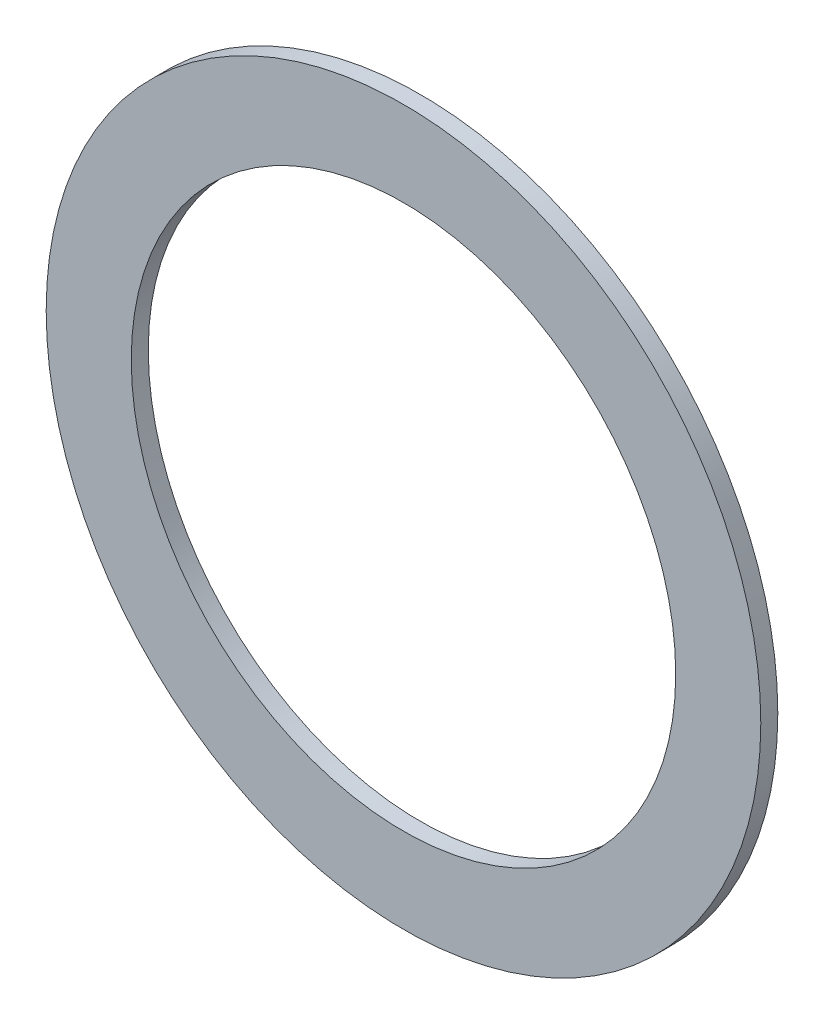
ISO-10303-21;
HEADER;
FILE_DESCRIPTION(('STEP AP214'),'2;1');
FILE_NAME('part.step','',(''),(''),'','','');
FILE_SCHEMA(('AUTOMOTIVE_DESIGN { 1 0 10303 214 1 1 1 1 }'));
ENDSEC;
DATA;
#1=APPLICATION_CONTEXT('core data for automotive mechanical design processes');
#2=APPLICATION_PROTOCOL_DEFINITION('international standard','automotive_design',2000,#1);
#3=PRODUCT_CONTEXT('',#1,'mechanical');
#4=PRODUCT('Part','Part','',(#3));
#5=PRODUCT_RELATED_PRODUCT_CATEGORY('part','',(#4));
#6=PRODUCT_DEFINITION_FORMATION('','',#4);
#7=PRODUCT_DEFINITION_CONTEXT('part definition',#1,'design');
#8=PRODUCT_DEFINITION('design','',#6,#7);
#9=PRODUCT_DEFINITION_SHAPE('','',#8);
#10=(LENGTH_UNIT() NAMED_UNIT(*) SI_UNIT(.MILLI.,.METRE.));
#11=(NAMED_UNIT(*) PLANE_ANGLE_UNIT() SI_UNIT($,.RADIAN.));
#12=(NAMED_UNIT(*) SI_UNIT($,.STERADIAN.) SOLID_ANGLE_UNIT());
#13=UNCERTAINTY_MEASURE_WITH_UNIT(LENGTH_MEASURE(1.E-05),#10,'distance_accuracy_value','');
#14=(GEOMETRIC_REPRESENTATION_CONTEXT(3) GLOBAL_UNCERTAINTY_ASSIGNED_CONTEXT((#13)) GLOBAL_UNIT_ASSIGNED_CONTEXT((#10,
#11,#12)) REPRESENTATION_CONTEXT('',''));
#15=CARTESIAN_POINT('',(0.,0.,0.));
#16=DIRECTION('',(0.,0.,1.));
#17=DIRECTION('',(1.,0.,0.));
#18=AXIS2_PLACEMENT_3D('',#15,#16,#17);
#19=CARTESIAN_POINT('',(0.,0.,0.5));
#20=DIRECTION('',(0.,0.,1.));
#21=DIRECTION('',(1.,0.,0.));
#22=AXIS2_PLACEMENT_3D('',#19,#20,#21);
#23=PLANE('',#22);
#24=CARTESIAN_POINT('',(0.,0.,0.5));
#25=DIRECTION('',(0.,0.,1.));
#26=DIRECTION('',(1.,0.,0.));
#27=AXIS2_PLACEMENT_3D('',#24,#25,#26);
#28=CIRCLE('',#27,10.5);
#29=CARTESIAN_POINT('',(10.5,0.,0.5));
#30=VERTEX_POINT('',#29);
#31=EDGE_CURVE('E10',#30,#30,#28,.T.);
#32=ORIENTED_EDGE('',*,*,#31,.T.);
#33=EDGE_LOOP('',(#32));
#34=FACE_BOUND('',#33,.T.);
#35=CARTESIAN_POINT('',(0.,0.,0.5));
#36=DIRECTION('',(0.,0.,1.));
#37=DIRECTION('',(1.,0.,0.));
#38=AXIS2_PLACEMENT_3D('',#35,#36,#37);
#39=CIRCLE('',#38,8.);
#40=CARTESIAN_POINT('',(8.,0.,0.5));
#41=VERTEX_POINT('',#40);
#42=EDGE_CURVE('E42',#41,#41,#39,.T.);
#43=ORIENTED_EDGE('',*,*,#42,.F.);
#44=EDGE_LOOP('',(#43));
#45=FACE_BOUND('',#44,.T.);
#46=ADVANCED_FACE('F31',(#34,#45),#23,.T.);
#47=CARTESIAN_POINT('',(0.,0.,0.));
#48=DIRECTION('',(0.,0.,1.));
#49=DIRECTION('',(1.,0.,0.));
#50=AXIS2_PLACEMENT_3D('',#47,#48,#49);
#51=PLANE('',#50);
#52=CARTESIAN_POINT('',(0.,0.,0.));
#53=DIRECTION('',(0.,0.,1.));
#54=DIRECTION('',(1.,0.,0.));
#55=AXIS2_PLACEMENT_3D('',#52,#53,#54);
#56=CIRCLE('',#55,10.5);
#57=CARTESIAN_POINT('',(10.5,0.,0.));
#58=VERTEX_POINT('',#57);
#59=EDGE_CURVE('E35',#58,#58,#56,.T.);
#60=ORIENTED_EDGE('',*,*,#59,.F.);
#61=EDGE_LOOP('',(#60));
#62=FACE_BOUND('',#61,.T.);
#63=CARTESIAN_POINT('',(0.,0.,0.));
#64=DIRECTION('',(0.,0.,1.));
#65=DIRECTION('',(1.,0.,0.));
#66=AXIS2_PLACEMENT_3D('',#63,#64,#65);
#67=CIRCLE('',#66,8.);
#68=CARTESIAN_POINT('',(8.,0.,0.));
#69=VERTEX_POINT('',#68);
#70=EDGE_CURVE('E44',#69,#69,#67,.T.);
#71=ORIENTED_EDGE('',*,*,#70,.T.);
#72=EDGE_LOOP('',(#71));
#73=FACE_BOUND('',#72,.T.);
#74=ADVANCED_FACE('F54',(#62,#73),#51,.F.);
#75=CARTESIAN_POINT('',(0.,0.,0.5));
#76=DIRECTION('',(0.,0.,-1.));
#77=DIRECTION('',(-1.,0.,0.));
#78=AXIS2_PLACEMENT_3D('',#75,#76,#77);
#79=CYLINDRICAL_SURFACE('',#78,10.5);
#80=ORIENTED_EDGE('',*,*,#31,.F.);
#81=EDGE_LOOP('',(#80));
#82=FACE_BOUND('',#81,.T.);
#83=ORIENTED_EDGE('',*,*,#59,.T.);
#84=EDGE_LOOP('',(#83));
#85=FACE_BOUND('',#84,.T.);
#86=ADVANCED_FACE('F33',(#82,#85),#79,.T.);
#87=CARTESIAN_POINT('',(0.,0.,0.5));
#88=DIRECTION('',(0.,0.,-1.));
#89=DIRECTION('',(-1.,0.,0.));
#90=AXIS2_PLACEMENT_3D('',#87,#88,#89);
#91=CYLINDRICAL_SURFACE('',#90,8.);
#92=ORIENTED_EDGE('',*,*,#42,.T.);
#93=EDGE_LOOP('',(#92));
#94=FACE_BOUND('',#93,.T.);
#95=ORIENTED_EDGE('',*,*,#70,.F.);
#96=EDGE_LOOP('',(#95));
#97=FACE_BOUND('',#96,.T.);
#98=ADVANCED_FACE('F50',(#94,#97),#91,.F.);
#99=CLOSED_SHELL('',(#46,#74,#86,#98));
#100=MANIFOLD_SOLID_BREP('B2',#99);
#101=ADVANCED_BREP_SHAPE_REPRESENTATION('',(#18,#100),#14);
#102=SHAPE_DEFINITION_REPRESENTATION(#9,#101);
ENDSEC;
END-ISO-10303-21;
